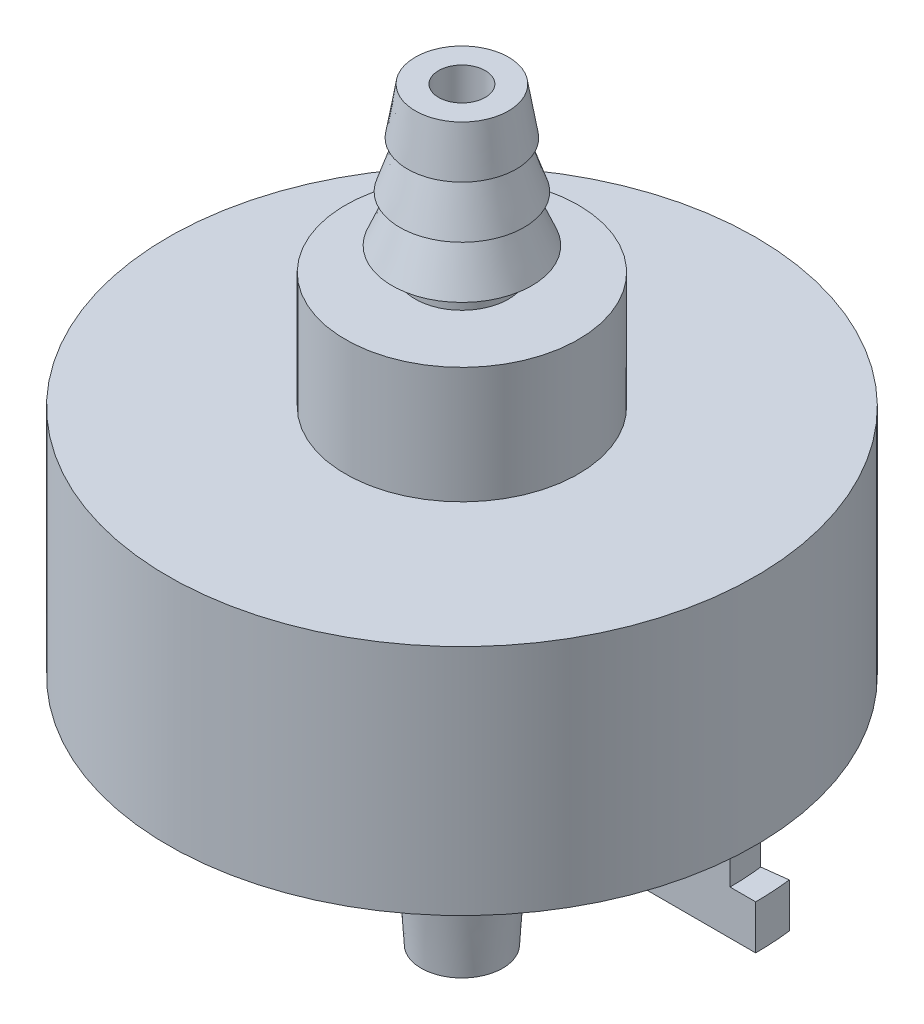
ISO-10303-21;
HEADER;
FILE_DESCRIPTION(('STEP AP214'),'2;1');
FILE_NAME('part.step','',(''),(''),'','','');
FILE_SCHEMA(('AUTOMOTIVE_DESIGN { 1 0 10303 214 1 1 1 1 }'));
ENDSEC;
DATA;
#1=APPLICATION_CONTEXT('core data for automotive mechanical design processes');
#2=APPLICATION_PROTOCOL_DEFINITION('international standard','automotive_design',2000,#1);
#3=PRODUCT_CONTEXT('',#1,'mechanical');
#4=PRODUCT('Part','Part','',(#3));
#5=PRODUCT_RELATED_PRODUCT_CATEGORY('part','',(#4));
#6=PRODUCT_DEFINITION_FORMATION('','',#4);
#7=PRODUCT_DEFINITION_CONTEXT('part definition',#1,'design');
#8=PRODUCT_DEFINITION('design','',#6,#7);
#9=PRODUCT_DEFINITION_SHAPE('','',#8);
#10=(LENGTH_UNIT() NAMED_UNIT(*) SI_UNIT(.MILLI.,.METRE.));
#11=(NAMED_UNIT(*) PLANE_ANGLE_UNIT() SI_UNIT($,.RADIAN.));
#12=(NAMED_UNIT(*) SI_UNIT($,.STERADIAN.) SOLID_ANGLE_UNIT());
#13=UNCERTAINTY_MEASURE_WITH_UNIT(LENGTH_MEASURE(1.E-05),#10,'distance_accuracy_value','');
#14=(GEOMETRIC_REPRESENTATION_CONTEXT(3) GLOBAL_UNCERTAINTY_ASSIGNED_CONTEXT((#13)) GLOBAL_UNIT_ASSIGNED_CONTEXT((#10,
#11,#12)) REPRESENTATION_CONTEXT('',''));
#15=CARTESIAN_POINT('',(0.,0.,0.));
#16=DIRECTION('',(0.,0.,1.));
#17=DIRECTION('',(1.,0.,0.));
#18=AXIS2_PLACEMENT_3D('',#15,#16,#17);
#19=CARTESIAN_POINT('',(8.97890000000001,-10.,0.));
#20=DIRECTION('',(0.,-1.,0.));
#21=DIRECTION('',(0.,0.,-1.));
#22=AXIS2_PLACEMENT_3D('',#19,#20,#21);
#23=PLANE('',#22);
#24=CARTESIAN_POINT('',(8.97890000000001,-10.,0.));
#25=DIRECTION('',(0.,-1.,0.));
#26=DIRECTION('',(0.,0.,-1.));
#27=AXIS2_PLACEMENT_3D('',#24,#25,#26);
#28=CIRCLE('',#27,12.61);
#29=CARTESIAN_POINT('',(8.97890000000001,-10.,-12.61));
#30=VERTEX_POINT('',#29);
#31=EDGE_CURVE('E288',#30,#30,#28,.T.);
#32=ORIENTED_EDGE('',*,*,#31,.T.);
#33=EDGE_LOOP('',(#32));
#34=FACE_BOUND('',#33,.T.);
#35=DIRECTION('',(-0.992546151641322,0.,0.121869343405148));
#36=VECTOR('',#35,1.);
#37=CARTESIAN_POINT('',(-2.4453062053916,-10.,1.40271614259325));
#38=LINE('',#37,#36);
#39=CARTESIAN_POINT('',(0.135313788875836,-10.,1.08585584973987));
#40=VERTEX_POINT('',#39);
#41=CARTESIAN_POINT('',(-2.4453062053916,-10.,1.40271614259325));
#42=VERTEX_POINT('',#41);
#43=EDGE_CURVE('E256',#40,#42,#38,.T.);
#44=ORIENTED_EDGE('',*,*,#43,.F.);
#45=CARTESIAN_POINT('',(8.97890000000001,-10.,0.));
#46=DIRECTION('',(0.,-1.,0.));
#47=DIRECTION('',(0.,0.,-1.));
#48=AXIS2_PLACEMENT_3D('',#45,#46,#47);
#49=CIRCLE('',#48,8.91);
#50=CARTESIAN_POINT('',(0.0689000000000152,-10.,0.));
#51=VERTEX_POINT('',#50);
#52=EDGE_CURVE('E280',#40,#51,#49,.T.);
#53=ORIENTED_EDGE('',*,*,#52,.T.);
#54=DIRECTION('',(-1.,0.,0.));
#55=VECTOR('',#54,1.);
#56=CARTESIAN_POINT('',(-2.53109999999998,-10.,0.));
#57=LINE('',#56,#55);
#58=CARTESIAN_POINT('',(-2.53109999999998,-10.,0.));
#59=VERTEX_POINT('',#58);
#60=EDGE_CURVE('E234',#51,#59,#57,.T.);
#61=ORIENTED_EDGE('',*,*,#60,.T.);
#62=CARTESIAN_POINT('',(8.97890000000001,-10.,0.));
#63=DIRECTION('',(0.,-1.,0.));
#64=DIRECTION('',(0.,0.,-1.));
#65=AXIS2_PLACEMENT_3D('',#62,#63,#64);
#66=CIRCLE('',#65,11.51);
#67=EDGE_CURVE('E278',#42,#59,#66,.T.);
#68=ORIENTED_EDGE('',*,*,#67,.F.);
#69=EDGE_LOOP('',(#44,#53,#61,#68));
#70=FACE_BOUND('',#69,.T.);
#71=DIRECTION('',(0.992546151641322,0.,-0.121869343405148));
#72=VECTOR('',#71,1.);
#73=CARTESIAN_POINT('',(20.4031062053916,-10.,-1.40271614259325));
#74=LINE('',#73,#72);
#75=CARTESIAN_POINT('',(17.8224862111242,-10.,-1.08585584973987));
#76=VERTEX_POINT('',#75);
#77=CARTESIAN_POINT('',(20.4031062053916,-10.,-1.40271614259325));
#78=VERTEX_POINT('',#77);
#79=EDGE_CURVE('E200',#76,#78,#74,.T.);
#80=ORIENTED_EDGE('',*,*,#79,.F.);
#81=CARTESIAN_POINT('',(8.97890000000001,-10.,0.));
#82=DIRECTION('',(0.,-1.,0.));
#83=DIRECTION('',(0.,0.,1.));
#84=AXIS2_PLACEMENT_3D('',#81,#82,#83);
#85=CIRCLE('',#84,8.91);
#86=CARTESIAN_POINT('',(17.8889,-10.,0.));
#87=VERTEX_POINT('',#86);
#88=EDGE_CURVE('E223',#76,#87,#85,.T.);
#89=ORIENTED_EDGE('',*,*,#88,.T.);
#90=DIRECTION('',(1.,0.,0.));
#91=VECTOR('',#90,1.);
#92=CARTESIAN_POINT('',(20.4889,-10.,0.));
#93=LINE('',#92,#91);
#94=CARTESIAN_POINT('',(20.4889,-10.,0.));
#95=VERTEX_POINT('',#94);
#96=EDGE_CURVE('E179',#87,#95,#93,.T.);
#97=ORIENTED_EDGE('',*,*,#96,.T.);
#98=CARTESIAN_POINT('',(8.97890000000001,-10.,0.));
#99=DIRECTION('',(0.,-1.,0.));
#100=DIRECTION('',(0.,0.,1.));
#101=AXIS2_PLACEMENT_3D('',#98,#99,#100);
#102=CIRCLE('',#101,11.51);
#103=EDGE_CURVE('E221',#78,#95,#102,.T.);
#104=ORIENTED_EDGE('',*,*,#103,.F.);
#105=EDGE_LOOP('',(#80,#89,#97,#104));
#106=FACE_BOUND('',#105,.T.);
#107=CARTESIAN_POINT('',(8.97890000000001,-10.,0.));
#108=DIRECTION('',(0.,-1.,0.));
#109=DIRECTION('',(0.,0.,-1.));
#110=AXIS2_PLACEMENT_3D('',#107,#108,#109);
#111=CIRCLE('',#110,2.75);
#112=CARTESIAN_POINT('',(6.90017726364211,-10.,-1.80039211988631));
#113=VERTEX_POINT('',#112);
#114=EDGE_CURVE('E335',#113,#113,#111,.T.);
#115=ORIENTED_EDGE('',*,*,#114,.F.);
#116=EDGE_LOOP('',(#115));
#117=FACE_BOUND('',#116,.T.);
#118=ADVANCED_FACE('F37',(#34,#70,#106,#117),#23,.T.);
#119=CARTESIAN_POINT('',(8.97890000000001,0.,0.));
#120=DIRECTION('',(0.,-1.,0.));
#121=DIRECTION('',(0.,0.,-1.));
#122=AXIS2_PLACEMENT_3D('',#119,#120,#121);
#123=CYLINDRICAL_SURFACE('',#122,0.999999999999999);
#124=CARTESIAN_POINT('',(8.97890000000001,12.,0.));
#125=DIRECTION('',(0.,-1.,0.));
#126=DIRECTION('',(0.,0.,-1.));
#127=AXIS2_PLACEMENT_3D('',#124,#125,#126);
#128=CIRCLE('',#127,0.999999999999999);
#129=CARTESIAN_POINT('',(8.97890000000001,12.,-0.999999999999999));
#130=VERTEX_POINT('',#129);
#131=EDGE_CURVE('E12',#130,#130,#128,.T.);
#132=ORIENTED_EDGE('',*,*,#131,.F.);
#133=EDGE_LOOP('',(#132));
#134=FACE_BOUND('',#133,.T.);
#135=CARTESIAN_POINT('',(8.97890000000001,-20.,0.));
#136=DIRECTION('',(0.,-1.,0.));
#137=DIRECTION('',(0.,0.,-1.));
#138=AXIS2_PLACEMENT_3D('',#135,#136,#137);
#139=CIRCLE('',#138,0.999999999999996);
#140=CARTESIAN_POINT('',(8.97890000000001,-20.,-0.999999999999996));
#141=VERTEX_POINT('',#140);
#142=EDGE_CURVE('E333',#141,#141,#139,.T.);
#143=ORIENTED_EDGE('',*,*,#142,.T.);
#144=EDGE_LOOP('',(#143));
#145=FACE_BOUND('',#144,.T.);
#146=ADVANCED_FACE('F39',(#134,#145),#123,.F.);
#147=CARTESIAN_POINT('',(7.97890000000001,12.,0.));
#148=DIRECTION('',(0.,-1.,0.));
#149=DIRECTION('',(0.,0.,-1.));
#150=AXIS2_PLACEMENT_3D('',#147,#148,#149);
#151=PLANE('',#150);
#152=CARTESIAN_POINT('',(8.97890000000001,12.,0.));
#153=DIRECTION('',(0.,-1.,0.));
#154=DIRECTION('',(0.,0.,-1.));
#155=AXIS2_PLACEMENT_3D('',#152,#153,#154);
#156=CIRCLE('',#155,2.);
#157=CARTESIAN_POINT('',(8.97890000000001,12.,-2.));
#158=VERTEX_POINT('',#157);
#159=EDGE_CURVE('E45',#158,#158,#156,.T.);
#160=ORIENTED_EDGE('',*,*,#159,.F.);
#161=EDGE_LOOP('',(#160));
#162=FACE_BOUND('',#161,.T.);
#163=ORIENTED_EDGE('',*,*,#131,.T.);
#164=EDGE_LOOP('',(#163));
#165=FACE_BOUND('',#164,.T.);
#166=ADVANCED_FACE('F324',(#162,#165),#151,.F.);
#167=CARTESIAN_POINT('',(8.97890000000001,12.,0.));
#168=DIRECTION('',(0.,-1.,0.));
#169=DIRECTION('',(0.,0.,-1.));
#170=AXIS2_PLACEMENT_3D('',#167,#168,#169);
#171=CONICAL_SURFACE('',#170,2.,0.165148677414627);
#172=CARTESIAN_POINT('',(8.97890000000001,10.,0.));
#173=DIRECTION('',(0.,-1.,0.));
#174=DIRECTION('',(0.,0.,-1.));
#175=AXIS2_PLACEMENT_3D('',#172,#173,#174);
#176=CIRCLE('',#175,2.33333333333333);
#177=CARTESIAN_POINT('',(8.97890000000001,10.,-2.33333333333333));
#178=VERTEX_POINT('',#177);
#179=EDGE_CURVE('E317',#178,#178,#176,.T.);
#180=ORIENTED_EDGE('',*,*,#179,.F.);
#181=EDGE_LOOP('',(#180));
#182=FACE_BOUND('',#181,.T.);
#183=ORIENTED_EDGE('',*,*,#159,.T.);
#184=EDGE_LOOP('',(#183));
#185=FACE_BOUND('',#184,.T.);
#186=ADVANCED_FACE('F322',(#182,#185),#171,.T.);
#187=CARTESIAN_POINT('',(6.97890000000001,10.,0.));
#188=DIRECTION('',(0.,1.,0.));
#189=DIRECTION('',(0.,0.,1.));
#190=AXIS2_PLACEMENT_3D('',#187,#188,#189);
#191=PLANE('',#190);
#192=CARTESIAN_POINT('',(8.97890000000001,10.,0.));
#193=DIRECTION('',(0.,-1.,0.));
#194=DIRECTION('',(0.,0.,-1.));
#195=AXIS2_PLACEMENT_3D('',#192,#193,#194);
#196=CIRCLE('',#195,2.);
#197=CARTESIAN_POINT('',(8.97890000000001,10.,-2.));
#198=VERTEX_POINT('',#197);
#199=EDGE_CURVE('E314',#198,#198,#196,.T.);
#200=ORIENTED_EDGE('',*,*,#199,.F.);
#201=EDGE_LOOP('',(#200));
#202=FACE_BOUND('',#201,.T.);
#203=ORIENTED_EDGE('',*,*,#179,.T.);
#204=EDGE_LOOP('',(#203));
#205=FACE_BOUND('',#204,.T.);
#206=ADVANCED_FACE('F483',(#202,#205),#191,.F.);
#207=CARTESIAN_POINT('',(8.97890000000001,10.,0.));
#208=DIRECTION('',(0.,-1.,0.));
#209=DIRECTION('',(0.,0.,-1.));
#210=AXIS2_PLACEMENT_3D('',#207,#208,#209);
#211=CONICAL_SURFACE('',#210,2.,0.321750554396643);
#212=CARTESIAN_POINT('',(8.97890000000001,8.,0.));
#213=DIRECTION('',(0.,-1.,0.));
#214=DIRECTION('',(0.,0.,-1.));
#215=AXIS2_PLACEMENT_3D('',#212,#213,#214);
#216=CIRCLE('',#215,2.66666666666667);
#217=CARTESIAN_POINT('',(8.97890000000001,8.,-2.66666666666667));
#218=VERTEX_POINT('',#217);
#219=EDGE_CURVE('E311',#218,#218,#216,.T.);
#220=ORIENTED_EDGE('',*,*,#219,.F.);
#221=EDGE_LOOP('',(#220));
#222=FACE_BOUND('',#221,.T.);
#223=ORIENTED_EDGE('',*,*,#199,.T.);
#224=EDGE_LOOP('',(#223));
#225=FACE_BOUND('',#224,.T.);
#226=ADVANCED_FACE('F479',(#222,#225),#211,.T.);
#227=CARTESIAN_POINT('',(6.31223333333335,8.,0.));
#228=DIRECTION('',(0.,1.,0.));
#229=DIRECTION('',(0.,0.,1.));
#230=AXIS2_PLACEMENT_3D('',#227,#228,#229);
#231=PLANE('',#230);
#232=CARTESIAN_POINT('',(8.97890000000001,8.,0.));
#233=DIRECTION('',(0.,-1.,0.));
#234=DIRECTION('',(0.,0.,-1.));
#235=AXIS2_PLACEMENT_3D('',#232,#233,#234);
#236=CIRCLE('',#235,2.16666666666667);
#237=CARTESIAN_POINT('',(8.97890000000001,8.,-2.16666666666667));
#238=VERTEX_POINT('',#237);
#239=EDGE_CURVE('E308',#238,#238,#236,.T.);
#240=ORIENTED_EDGE('',*,*,#239,.F.);
#241=EDGE_LOOP('',(#240));
#242=FACE_BOUND('',#241,.T.);
#243=ORIENTED_EDGE('',*,*,#219,.T.);
#244=EDGE_LOOP('',(#243));
#245=FACE_BOUND('',#244,.T.);
#246=ADVANCED_FACE('F475',(#242,#245),#231,.F.);
#247=CARTESIAN_POINT('',(8.97890000000001,8.,0.));
#248=DIRECTION('',(0.,-1.,0.));
#249=DIRECTION('',(0.,0.,-1.));
#250=AXIS2_PLACEMENT_3D('',#247,#248,#249);
#251=CONICAL_SURFACE('',#250,2.16666666666667,0.394791119699761);
#252=CARTESIAN_POINT('',(8.97890000000001,6.,0.));
#253=DIRECTION('',(0.,-1.,0.));
#254=DIRECTION('',(0.,0.,-1.));
#255=AXIS2_PLACEMENT_3D('',#252,#253,#254);
#256=CIRCLE('',#255,3.);
#257=CARTESIAN_POINT('',(8.97890000000001,6.,-3.));
#258=VERTEX_POINT('',#257);
#259=EDGE_CURVE('E305',#258,#258,#256,.T.);
#260=ORIENTED_EDGE('',*,*,#259,.F.);
#261=EDGE_LOOP('',(#260));
#262=FACE_BOUND('',#261,.T.);
#263=ORIENTED_EDGE('',*,*,#239,.T.);
#264=EDGE_LOOP('',(#263));
#265=FACE_BOUND('',#264,.T.);
#266=ADVANCED_FACE('F471',(#262,#265),#251,.T.);
#267=CARTESIAN_POINT('',(6.97890000000001,6.,0.));
#268=DIRECTION('',(0.,1.,0.));
#269=DIRECTION('',(0.,0.,1.));
#270=AXIS2_PLACEMENT_3D('',#267,#268,#269);
#271=PLANE('',#270);
#272=CARTESIAN_POINT('',(8.97890000000001,6.,0.));
#273=DIRECTION('',(0.,-1.,0.));
#274=DIRECTION('',(0.,0.,-1.));
#275=AXIS2_PLACEMENT_3D('',#272,#273,#274);
#276=CIRCLE('',#275,2.);
#277=CARTESIAN_POINT('',(8.97890000000001,6.,-2.));
#278=VERTEX_POINT('',#277);
#279=EDGE_CURVE('E302',#278,#278,#276,.T.);
#280=ORIENTED_EDGE('',*,*,#279,.F.);
#281=EDGE_LOOP('',(#280));
#282=FACE_BOUND('',#281,.T.);
#283=ORIENTED_EDGE('',*,*,#259,.T.);
#284=EDGE_LOOP('',(#283));
#285=FACE_BOUND('',#284,.T.);
#286=ADVANCED_FACE('F467',(#282,#285),#271,.F.);
#287=CARTESIAN_POINT('',(8.97890000000001,0.,0.));
#288=DIRECTION('',(0.,-1.,0.));
#289=DIRECTION('',(0.,0.,-1.));
#290=AXIS2_PLACEMENT_3D('',#287,#288,#289);
#291=CYLINDRICAL_SURFACE('',#290,2.);
#292=CARTESIAN_POINT('',(8.97890000000001,5.,0.));
#293=DIRECTION('',(0.,-1.,0.));
#294=DIRECTION('',(0.,0.,-1.));
#295=AXIS2_PLACEMENT_3D('',#292,#293,#294);
#296=CIRCLE('',#295,2.);
#297=CARTESIAN_POINT('',(8.97890000000001,5.,-2.));
#298=VERTEX_POINT('',#297);
#299=EDGE_CURVE('E299',#298,#298,#296,.T.);
#300=ORIENTED_EDGE('',*,*,#299,.F.);
#301=EDGE_LOOP('',(#300));
#302=FACE_BOUND('',#301,.T.);
#303=ORIENTED_EDGE('',*,*,#279,.T.);
#304=EDGE_LOOP('',(#303));
#305=FACE_BOUND('',#304,.T.);
#306=ADVANCED_FACE('F463',(#302,#305),#291,.T.);
#307=CARTESIAN_POINT('',(6.97890000000001,5.,0.));
#308=DIRECTION('',(0.,-1.,0.));
#309=DIRECTION('',(0.,0.,-1.));
#310=AXIS2_PLACEMENT_3D('',#307,#308,#309);
#311=PLANE('',#310);
#312=CARTESIAN_POINT('',(8.97890000000001,5.,0.));
#313=DIRECTION('',(0.,-1.,0.));
#314=DIRECTION('',(0.,0.,-1.));
#315=AXIS2_PLACEMENT_3D('',#312,#313,#314);
#316=CIRCLE('',#315,5.);
#317=CARTESIAN_POINT('',(8.97890000000001,5.,-5.));
#318=VERTEX_POINT('',#317);
#319=EDGE_CURVE('E296',#318,#318,#316,.T.);
#320=ORIENTED_EDGE('',*,*,#319,.F.);
#321=EDGE_LOOP('',(#320));
#322=FACE_BOUND('',#321,.T.);
#323=ORIENTED_EDGE('',*,*,#299,.T.);
#324=EDGE_LOOP('',(#323));
#325=FACE_BOUND('',#324,.T.);
#326=ADVANCED_FACE('F459',(#322,#325),#311,.F.);
#327=CARTESIAN_POINT('',(8.97890000000001,0.,0.));
#328=DIRECTION('',(0.,-1.,0.));
#329=DIRECTION('',(0.,0.,-1.));
#330=AXIS2_PLACEMENT_3D('',#327,#328,#329);
#331=CYLINDRICAL_SURFACE('',#330,5.);
#332=CARTESIAN_POINT('',(8.97890000000001,0.,0.));
#333=DIRECTION('',(0.,-1.,0.));
#334=DIRECTION('',(0.,0.,-1.));
#335=AXIS2_PLACEMENT_3D('',#332,#333,#334);
#336=CIRCLE('',#335,5.);
#337=CARTESIAN_POINT('',(8.97890000000001,0.,-5.));
#338=VERTEX_POINT('',#337);
#339=EDGE_CURVE('E291',#338,#338,#336,.T.);
#340=ORIENTED_EDGE('',*,*,#339,.F.);
#341=EDGE_LOOP('',(#340));
#342=FACE_BOUND('',#341,.T.);
#343=ORIENTED_EDGE('',*,*,#319,.T.);
#344=EDGE_LOOP('',(#343));
#345=FACE_BOUND('',#344,.T.);
#346=ADVANCED_FACE('F452',(#342,#345),#331,.T.);
#347=CARTESIAN_POINT('',(8.97890000000001,0.,0.));
#348=DIRECTION('',(0.,-1.,0.));
#349=DIRECTION('',(0.,0.,-1.));
#350=AXIS2_PLACEMENT_3D('',#347,#348,#349);
#351=PLANE('',#350);
#352=ORIENTED_EDGE('',*,*,#339,.T.);
#353=EDGE_LOOP('',(#352));
#354=FACE_BOUND('',#353,.T.);
#355=CARTESIAN_POINT('',(8.97890000000001,0.,0.));
#356=DIRECTION('',(0.,-1.,0.));
#357=DIRECTION('',(0.,0.,-1.));
#358=AXIS2_PLACEMENT_3D('',#355,#356,#357);
#359=CIRCLE('',#358,12.61);
#360=CARTESIAN_POINT('',(8.97890000000001,0.,-12.61));
#361=VERTEX_POINT('',#360);
#362=EDGE_CURVE('E287',#361,#361,#359,.T.);
#363=ORIENTED_EDGE('',*,*,#362,.F.);
#364=EDGE_LOOP('',(#363));
#365=FACE_BOUND('',#364,.T.);
#366=ADVANCED_FACE('F449',(#354,#365),#351,.F.);
#367=CARTESIAN_POINT('',(8.97890000000001,-10.,0.));
#368=DIRECTION('',(0.,1.,0.));
#369=DIRECTION('',(0.,0.,1.));
#370=AXIS2_PLACEMENT_3D('',#367,#368,#369);
#371=CYLINDRICAL_SURFACE('',#370,12.61);
#372=ORIENTED_EDGE('',*,*,#31,.F.);
#373=EDGE_LOOP('',(#372));
#374=FACE_BOUND('',#373,.T.);
#375=ORIENTED_EDGE('',*,*,#362,.T.);
#376=EDGE_LOOP('',(#375));
#377=FACE_BOUND('',#376,.T.);
#378=ADVANCED_FACE('F422',(#374,#377),#371,.T.);
#379=CARTESIAN_POINT('',(8.97890000000001,-10.,0.));
#380=DIRECTION('',(0.,-1.,0.));
#381=DIRECTION('',(0.,0.,-1.));
#382=AXIS2_PLACEMENT_3D('',#379,#380,#381);
#383=CYLINDRICAL_SURFACE('',#382,7.81);
#384=CARTESIAN_POINT('',(8.97890000000001,-12.1,0.));
#385=DIRECTION('',(0.,-1.,0.));
#386=DIRECTION('',(0.,0.,-1.));
#387=AXIS2_PLACEMENT_3D('',#384,#385,#386);
#388=CIRCLE('',#387,7.81);
#389=CARTESIAN_POINT('',(1.22711455568129,-12.1,0.951799571994204));
#390=VERTEX_POINT('',#389);
#391=CARTESIAN_POINT('',(1.16890000000002,-12.1,0.));
#392=VERTEX_POINT('',#391);
#393=EDGE_CURVE('E285',#390,#392,#388,.T.);
#394=ORIENTED_EDGE('',*,*,#393,.F.);
#395=DIRECTION('',(0.,1.,0.));
#396=VECTOR('',#395,1.);
#397=CARTESIAN_POINT('',(1.22711455568129,-12.1,0.951799571994204));
#398=LINE('',#397,#396);
#399=CARTESIAN_POINT('',(1.22711455568129,-14.,0.951799571994204));
#400=VERTEX_POINT('',#399);
#401=EDGE_CURVE('E247',#400,#390,#398,.T.);
#402=ORIENTED_EDGE('',*,*,#401,.F.);
#403=CARTESIAN_POINT('',(8.97890000000001,-14.,0.));
#404=DIRECTION('',(0.,-1.,0.));
#405=DIRECTION('',(0.,0.,-1.));
#406=AXIS2_PLACEMENT_3D('',#403,#404,#405);
#407=CIRCLE('',#406,7.81);
#408=CARTESIAN_POINT('',(1.16890000000002,-14.,0.));
#409=VERTEX_POINT('',#408);
#410=EDGE_CURVE('E270',#400,#409,#407,.T.);
#411=ORIENTED_EDGE('',*,*,#410,.T.);
#412=DIRECTION('',(0.,1.,0.));
#413=VECTOR('',#412,1.);
#414=CARTESIAN_POINT('',(1.16890000000002,-12.1,0.));
#415=LINE('',#414,#413);
#416=EDGE_CURVE('E165',#409,#392,#415,.T.);
#417=ORIENTED_EDGE('',*,*,#416,.T.);
#418=EDGE_LOOP('',(#394,#402,#411,#417));
#419=FACE_BOUND('',#418,.T.);
#420=ADVANCED_FACE('F418',(#419),#383,.F.);
#421=CARTESIAN_POINT('',(1.22711455568129,-12.1,0.951799571994204));
#422=DIRECTION('',(0.,-1.,0.));
#423=DIRECTION('',(0.,0.,-1.));
#424=AXIS2_PLACEMENT_3D('',#421,#422,#423);
#425=PLANE('',#424);
#426=CARTESIAN_POINT('',(8.97890000000001,-12.1,0.));
#427=DIRECTION('',(0.,-1.,0.));
#428=DIRECTION('',(0.,0.,-1.));
#429=AXIS2_PLACEMENT_3D('',#426,#427,#428);
#430=CIRCLE('',#429,8.91);
#431=CARTESIAN_POINT('',(0.135313788875837,-12.1,1.08585584973987));
#432=VERTEX_POINT('',#431);
#433=CARTESIAN_POINT('',(0.0689000000000156,-12.1,0.));
#434=VERTEX_POINT('',#433);
#435=EDGE_CURVE('E283',#432,#434,#430,.T.);
#436=ORIENTED_EDGE('',*,*,#435,.F.);
#437=DIRECTION('',(-0.992546151641322,0.,0.121869343405148));
#438=VECTOR('',#437,1.);
#439=CARTESIAN_POINT('',(1.22711455568129,-12.1,0.951799571994204));
#440=LINE('',#439,#438);
#441=EDGE_CURVE('E250',#390,#432,#440,.T.);
#442=ORIENTED_EDGE('',*,*,#441,.F.);
#443=ORIENTED_EDGE('',*,*,#393,.T.);
#444=DIRECTION('',(-1.,0.,0.));
#445=VECTOR('',#444,1.);
#446=CARTESIAN_POINT('',(1.16890000000002,-12.1,0.));
#447=LINE('',#446,#445);
#448=EDGE_CURVE('E229',#392,#434,#447,.T.);
#449=ORIENTED_EDGE('',*,*,#448,.T.);
#450=EDGE_LOOP('',(#436,#442,#443,#449));
#451=FACE_BOUND('',#450,.T.);
#452=ADVANCED_FACE('F421',(#451),#425,.F.);
#453=CARTESIAN_POINT('',(8.97890000000001,-10.,0.));
#454=DIRECTION('',(0.,-1.,0.));
#455=DIRECTION('',(0.,0.,-1.));
#456=AXIS2_PLACEMENT_3D('',#453,#454,#455);
#457=CYLINDRICAL_SURFACE('',#456,8.91);
#458=ORIENTED_EDGE('',*,*,#52,.F.);
#459=DIRECTION('',(0.,1.,0.));
#460=VECTOR('',#459,1.);
#461=CARTESIAN_POINT('',(0.135313788875836,-10.,1.08585584973987));
#462=LINE('',#461,#460);
#463=EDGE_CURVE('E253',#432,#40,#462,.T.);
#464=ORIENTED_EDGE('',*,*,#463,.F.);
#465=ORIENTED_EDGE('',*,*,#435,.T.);
#466=DIRECTION('',(0.,1.,0.));
#467=VECTOR('',#466,1.);
#468=CARTESIAN_POINT('',(0.0689000000000152,-10.,0.));
#469=LINE('',#468,#467);
#470=EDGE_CURVE('E232',#434,#51,#469,.T.);
#471=ORIENTED_EDGE('',*,*,#470,.T.);
#472=EDGE_LOOP('',(#458,#464,#465,#471));
#473=FACE_BOUND('',#472,.T.);
#474=ADVANCED_FACE('F438',(#473),#457,.F.);
#475=CARTESIAN_POINT('',(8.97890000000001,-10.,0.));
#476=DIRECTION('',(0.,-1.,0.));
#477=DIRECTION('',(0.,0.,-1.));
#478=AXIS2_PLACEMENT_3D('',#475,#476,#477);
#479=CYLINDRICAL_SURFACE('',#478,11.51);
#480=CARTESIAN_POINT('',(8.97890000000001,-12.1,0.));
#481=DIRECTION('',(0.,-1.,0.));
#482=DIRECTION('',(0.,0.,-1.));
#483=AXIS2_PLACEMENT_3D('',#480,#481,#482);
#484=CIRCLE('',#483,11.51);
#485=CARTESIAN_POINT('',(-2.4453062053916,-12.1,1.40271614259325));
#486=VERTEX_POINT('',#485);
#487=CARTESIAN_POINT('',(-2.53109999999998,-12.1,0.));
#488=VERTEX_POINT('',#487);
#489=EDGE_CURVE('E276',#486,#488,#484,.T.);
#490=ORIENTED_EDGE('',*,*,#489,.F.);
#491=DIRECTION('',(0.,-1.,0.));
#492=VECTOR('',#491,1.);
#493=CARTESIAN_POINT('',(-2.4453062053916,-10.,1.40271614259325));
#494=LINE('',#493,#492);
#495=EDGE_CURVE('E258',#42,#486,#494,.T.);
#496=ORIENTED_EDGE('',*,*,#495,.F.);
#497=ORIENTED_EDGE('',*,*,#67,.T.);
#498=DIRECTION('',(0.,-1.,0.));
#499=VECTOR('',#498,1.);
#500=CARTESIAN_POINT('',(-2.53109999999998,-10.,0.));
#501=LINE('',#500,#499);
#502=EDGE_CURVE('E60',#59,#488,#501,.T.);
#503=ORIENTED_EDGE('',*,*,#502,.T.);
#504=EDGE_LOOP('',(#490,#496,#497,#503));
#505=FACE_BOUND('',#504,.T.);
#506=ADVANCED_FACE('F434',(#505),#479,.T.);
#507=CARTESIAN_POINT('',(-3.53710697219705,-12.1,1.53677242033891));
#508=DIRECTION('',(0.,-1.,0.));
#509=DIRECTION('',(0.,0.,-1.));
#510=AXIS2_PLACEMENT_3D('',#507,#508,#509);
#511=PLANE('',#510);
#512=CARTESIAN_POINT('',(8.97890000000001,-12.1,0.));
#513=DIRECTION('',(0.,-1.,0.));
#514=DIRECTION('',(0.,0.,-1.));
#515=AXIS2_PLACEMENT_3D('',#512,#513,#514);
#516=CIRCLE('',#515,12.61);
#517=CARTESIAN_POINT('',(-3.53710697219705,-12.1,1.53677242033891));
#518=VERTEX_POINT('',#517);
#519=CARTESIAN_POINT('',(-3.63109999999998,-12.1,0.));
#520=VERTEX_POINT('',#519);
#521=EDGE_CURVE('E274',#518,#520,#516,.T.);
#522=ORIENTED_EDGE('',*,*,#521,.F.);
#523=DIRECTION('',(-0.992546151641322,0.,0.121869343405148));
#524=VECTOR('',#523,1.);
#525=CARTESIAN_POINT('',(-3.53710697219705,-12.1,1.53677242033891));
#526=LINE('',#525,#524);
#527=EDGE_CURVE('E261',#486,#518,#526,.T.);
#528=ORIENTED_EDGE('',*,*,#527,.F.);
#529=ORIENTED_EDGE('',*,*,#489,.T.);
#530=DIRECTION('',(-1.,0.,0.));
#531=VECTOR('',#530,1.);
#532=CARTESIAN_POINT('',(-3.63109999999998,-12.1,0.));
#533=LINE('',#532,#531);
#534=EDGE_CURVE('E238',#488,#520,#533,.T.);
#535=ORIENTED_EDGE('',*,*,#534,.T.);
#536=EDGE_LOOP('',(#522,#528,#529,#535));
#537=FACE_BOUND('',#536,.T.);
#538=ADVANCED_FACE('F430',(#537),#511,.F.);
#539=CARTESIAN_POINT('',(8.97890000000001,-10.,0.));
#540=DIRECTION('',(0.,-1.,0.));
#541=DIRECTION('',(0.,0.,-1.));
#542=AXIS2_PLACEMENT_3D('',#539,#540,#541);
#543=CYLINDRICAL_SURFACE('',#542,12.61);
#544=CARTESIAN_POINT('',(8.97890000000001,-14.,0.));
#545=DIRECTION('',(0.,-1.,0.));
#546=DIRECTION('',(0.,0.,-1.));
#547=AXIS2_PLACEMENT_3D('',#544,#545,#546);
#548=CIRCLE('',#547,12.61);
#549=CARTESIAN_POINT('',(-3.53710697219705,-14.,1.53677242033891));
#550=VERTEX_POINT('',#549);
#551=CARTESIAN_POINT('',(-3.63109999999998,-14.,0.));
#552=VERTEX_POINT('',#551);
#553=EDGE_CURVE('E272',#550,#552,#548,.T.);
#554=ORIENTED_EDGE('',*,*,#553,.F.);
#555=DIRECTION('',(0.,-1.,0.));
#556=VECTOR('',#555,1.);
#557=CARTESIAN_POINT('',(-3.53710697219705,-12.1,1.53677242033891));
#558=LINE('',#557,#556);
#559=EDGE_CURVE('E264',#518,#550,#558,.T.);
#560=ORIENTED_EDGE('',*,*,#559,.F.);
#561=ORIENTED_EDGE('',*,*,#521,.T.);
#562=DIRECTION('',(0.,-1.,0.));
#563=VECTOR('',#562,1.);
#564=CARTESIAN_POINT('',(-3.63109999999998,-12.1,0.));
#565=LINE('',#564,#563);
#566=EDGE_CURVE('E241',#520,#552,#565,.T.);
#567=ORIENTED_EDGE('',*,*,#566,.T.);
#568=EDGE_LOOP('',(#554,#560,#561,#567));
#569=FACE_BOUND('',#568,.T.);
#570=ADVANCED_FACE('F426',(#569),#543,.T.);
#571=CARTESIAN_POINT('',(-3.53710697219705,-14.,1.53677242033891));
#572=DIRECTION('',(0.,1.,0.));
#573=DIRECTION('',(0.,0.,1.));
#574=AXIS2_PLACEMENT_3D('',#571,#572,#573);
#575=PLANE('',#574);
#576=DIRECTION('',(0.992546151641322,0.,-0.121869343405148));
#577=VECTOR('',#576,1.);
#578=CARTESIAN_POINT('',(-3.53710697219705,-14.,1.53677242033891));
#579=LINE('',#578,#577);
#580=EDGE_CURVE('E267',#550,#400,#579,.T.);
#581=ORIENTED_EDGE('',*,*,#580,.F.);
#582=ORIENTED_EDGE('',*,*,#553,.T.);
#583=DIRECTION('',(1.,0.,0.));
#584=VECTOR('',#583,1.);
#585=CARTESIAN_POINT('',(-3.63109999999998,-14.,0.));
#586=LINE('',#585,#584);
#587=EDGE_CURVE('E244',#552,#409,#586,.T.);
#588=ORIENTED_EDGE('',*,*,#587,.T.);
#589=ORIENTED_EDGE('',*,*,#410,.F.);
#590=EDGE_LOOP('',(#581,#582,#588,#589));
#591=FACE_BOUND('',#590,.T.);
#592=ADVANCED_FACE('F416',(#591),#575,.F.);
#593=CARTESIAN_POINT('',(0.0669273590277341,0.,1.09425264750048));
#594=DIRECTION('',(0.121869343405148,0.,0.992546151641322));
#595=DIRECTION('',(0.992546151641322,0.,-0.121869343405148));
#596=AXIS2_PLACEMENT_3D('',#593,#594,#595);
#597=PLANE('',#596);
#598=ORIENTED_EDGE('',*,*,#401,.T.);
#599=ORIENTED_EDGE('',*,*,#441,.T.);
#600=ORIENTED_EDGE('',*,*,#463,.T.);
#601=ORIENTED_EDGE('',*,*,#43,.T.);
#602=ORIENTED_EDGE('',*,*,#495,.T.);
#603=ORIENTED_EDGE('',*,*,#527,.T.);
#604=ORIENTED_EDGE('',*,*,#559,.T.);
#605=ORIENTED_EDGE('',*,*,#580,.T.);
#606=EDGE_LOOP('',(#598,#599,#600,#601,#602,#603,#604,#605));
#607=FACE_BOUND('',#606,.T.);
#608=ADVANCED_FACE('F413',(#607),#597,.T.);
#609=CARTESIAN_POINT('',(0.,0.,0.));
#610=DIRECTION('',(0.,0.,1.));
#611=DIRECTION('',(1.,0.,0.));
#612=AXIS2_PLACEMENT_3D('',#609,#610,#611);
#613=PLANE('',#612);
#614=ORIENTED_EDGE('',*,*,#416,.F.);
#615=ORIENTED_EDGE('',*,*,#587,.F.);
#616=ORIENTED_EDGE('',*,*,#566,.F.);
#617=ORIENTED_EDGE('',*,*,#534,.F.);
#618=ORIENTED_EDGE('',*,*,#502,.F.);
#619=ORIENTED_EDGE('',*,*,#60,.F.);
#620=ORIENTED_EDGE('',*,*,#470,.F.);
#621=ORIENTED_EDGE('',*,*,#448,.F.);
#622=EDGE_LOOP('',(#614,#615,#616,#617,#618,#619,#620,#621));
#623=FACE_BOUND('',#622,.T.);
#624=ADVANCED_FACE('F389',(#623),#613,.F.);
#625=CARTESIAN_POINT('',(8.97890000000001,-10.,0.));
#626=DIRECTION('',(0.,-1.,0.));
#627=DIRECTION('',(0.,0.,1.));
#628=AXIS2_PLACEMENT_3D('',#625,#626,#627);
#629=CYLINDRICAL_SURFACE('',#628,7.81);
#630=CARTESIAN_POINT('',(8.97890000000001,-12.1,0.));
#631=DIRECTION('',(0.,-1.,0.));
#632=DIRECTION('',(0.,0.,1.));
#633=AXIS2_PLACEMENT_3D('',#630,#631,#632);
#634=CIRCLE('',#633,7.81);
#635=CARTESIAN_POINT('',(16.7306854443187,-12.1,-0.951799571994204));
#636=VERTEX_POINT('',#635);
#637=CARTESIAN_POINT('',(16.7889,-12.1,0.));
#638=VERTEX_POINT('',#637);
#639=EDGE_CURVE('E154',#636,#638,#634,.T.);
#640=ORIENTED_EDGE('',*,*,#639,.F.);
#641=DIRECTION('',(0.,1.,0.));
#642=VECTOR('',#641,1.);
#643=CARTESIAN_POINT('',(16.7306854443187,-12.1,-0.951799571994204));
#644=LINE('',#643,#642);
#645=CARTESIAN_POINT('',(16.7306854443187,-14.,-0.951799571994204));
#646=VERTEX_POINT('',#645);
#647=EDGE_CURVE('E194',#646,#636,#644,.T.);
#648=ORIENTED_EDGE('',*,*,#647,.F.);
#649=CARTESIAN_POINT('',(8.97890000000001,-14.,0.));
#650=DIRECTION('',(0.,-1.,0.));
#651=DIRECTION('',(0.,0.,1.));
#652=AXIS2_PLACEMENT_3D('',#649,#650,#651);
#653=CIRCLE('',#652,7.81);
#654=CARTESIAN_POINT('',(16.7889,-14.,0.));
#655=VERTEX_POINT('',#654);
#656=EDGE_CURVE('E171',#646,#655,#653,.T.);
#657=ORIENTED_EDGE('',*,*,#656,.T.);
#658=DIRECTION('',(0.,1.,0.));
#659=VECTOR('',#658,1.);
#660=CARTESIAN_POINT('',(16.7889,-12.1,0.));
#661=LINE('',#660,#659);
#662=EDGE_CURVE('E169',#655,#638,#661,.T.);
#663=ORIENTED_EDGE('',*,*,#662,.T.);
#664=EDGE_LOOP('',(#640,#648,#657,#663));
#665=FACE_BOUND('',#664,.T.);
#666=ADVANCED_FACE('F170',(#665),#629,.F.);
#667=CARTESIAN_POINT('',(16.7306854443187,-12.1,-0.951799571994204));
#668=DIRECTION('',(0.,-1.,0.));
#669=DIRECTION('',(0.,0.,1.));
#670=AXIS2_PLACEMENT_3D('',#667,#668,#669);
#671=PLANE('',#670);
#672=CARTESIAN_POINT('',(8.97890000000001,-12.1,0.));
#673=DIRECTION('',(0.,-1.,0.));
#674=DIRECTION('',(0.,0.,1.));
#675=AXIS2_PLACEMENT_3D('',#672,#673,#674);
#676=CIRCLE('',#675,8.91);
#677=CARTESIAN_POINT('',(17.8224862111242,-12.1,-1.08585584973987));
#678=VERTEX_POINT('',#677);
#679=CARTESIAN_POINT('',(17.8889,-12.1,0.));
#680=VERTEX_POINT('',#679);
#681=EDGE_CURVE('E166',#678,#680,#676,.T.);
#682=ORIENTED_EDGE('',*,*,#681,.F.);
#683=DIRECTION('',(0.992546151641322,0.,-0.121869343405148));
#684=VECTOR('',#683,1.);
#685=CARTESIAN_POINT('',(16.7306854443187,-12.1,-0.951799571994204));
#686=LINE('',#685,#684);
#687=EDGE_CURVE('E161',#636,#678,#686,.T.);
#688=ORIENTED_EDGE('',*,*,#687,.F.);
#689=ORIENTED_EDGE('',*,*,#639,.T.);
#690=DIRECTION('',(1.,0.,0.));
#691=VECTOR('',#690,1.);
#692=CARTESIAN_POINT('',(16.7889,-12.1,0.));
#693=LINE('',#692,#691);
#694=EDGE_CURVE('E158',#638,#680,#693,.T.);
#695=ORIENTED_EDGE('',*,*,#694,.T.);
#696=EDGE_LOOP('',(#682,#688,#689,#695));
#697=FACE_BOUND('',#696,.T.);
#698=ADVANCED_FACE('F156',(#697),#671,.F.);
#699=CARTESIAN_POINT('',(8.97890000000001,-10.,0.));
#700=DIRECTION('',(0.,-1.,0.));
#701=DIRECTION('',(0.,0.,1.));
#702=AXIS2_PLACEMENT_3D('',#699,#700,#701);
#703=CYLINDRICAL_SURFACE('',#702,8.91);
#704=ORIENTED_EDGE('',*,*,#88,.F.);
#705=DIRECTION('',(0.,1.,0.));
#706=VECTOR('',#705,1.);
#707=CARTESIAN_POINT('',(17.8224862111242,-10.,-1.08585584973987));
#708=LINE('',#707,#706);
#709=EDGE_CURVE('E197',#678,#76,#708,.T.);
#710=ORIENTED_EDGE('',*,*,#709,.F.);
#711=ORIENTED_EDGE('',*,*,#681,.T.);
#712=DIRECTION('',(0.,1.,0.));
#713=VECTOR('',#712,1.);
#714=CARTESIAN_POINT('',(17.8889,-10.,0.));
#715=LINE('',#714,#713);
#716=EDGE_CURVE('E177',#680,#87,#715,.T.);
#717=ORIENTED_EDGE('',*,*,#716,.T.);
#718=EDGE_LOOP('',(#704,#710,#711,#717));
#719=FACE_BOUND('',#718,.T.);
#720=ADVANCED_FACE('F404',(#719),#703,.F.);
#721=CARTESIAN_POINT('',(8.97890000000001,-10.,0.));
#722=DIRECTION('',(0.,-1.,0.));
#723=DIRECTION('',(0.,0.,1.));
#724=AXIS2_PLACEMENT_3D('',#721,#722,#723);
#725=CYLINDRICAL_SURFACE('',#724,11.51);
#726=CARTESIAN_POINT('',(8.97890000000001,-12.1,0.));
#727=DIRECTION('',(0.,-1.,0.));
#728=DIRECTION('',(0.,0.,1.));
#729=AXIS2_PLACEMENT_3D('',#726,#727,#728);
#730=CIRCLE('',#729,11.51);
#731=CARTESIAN_POINT('',(20.4031062053916,-12.1,-1.40271614259325));
#732=VERTEX_POINT('',#731);
#733=CARTESIAN_POINT('',(20.4889,-12.1,0.));
#734=VERTEX_POINT('',#733);
#735=EDGE_CURVE('E219',#732,#734,#730,.T.);
#736=ORIENTED_EDGE('',*,*,#735,.F.);
#737=DIRECTION('',(0.,-1.,0.));
#738=VECTOR('',#737,1.);
#739=CARTESIAN_POINT('',(20.4031062053916,-10.,-1.40271614259325));
#740=LINE('',#739,#738);
#741=EDGE_CURVE('E202',#78,#732,#740,.T.);
#742=ORIENTED_EDGE('',*,*,#741,.F.);
#743=ORIENTED_EDGE('',*,*,#103,.T.);
#744=DIRECTION('',(0.,-1.,0.));
#745=VECTOR('',#744,1.);
#746=CARTESIAN_POINT('',(20.4889,-10.,0.));
#747=LINE('',#746,#745);
#748=EDGE_CURVE('E52',#95,#734,#747,.T.);
#749=ORIENTED_EDGE('',*,*,#748,.T.);
#750=EDGE_LOOP('',(#736,#742,#743,#749));
#751=FACE_BOUND('',#750,.T.);
#752=ADVANCED_FACE('F400',(#751),#725,.T.);
#753=CARTESIAN_POINT('',(21.4949069721971,-12.1,-1.53677242033891));
#754=DIRECTION('',(0.,-1.,0.));
#755=DIRECTION('',(0.,0.,1.));
#756=AXIS2_PLACEMENT_3D('',#753,#754,#755);
#757=PLANE('',#756);
#758=CARTESIAN_POINT('',(8.97890000000001,-12.1,0.));
#759=DIRECTION('',(0.,-1.,0.));
#760=DIRECTION('',(0.,0.,1.));
#761=AXIS2_PLACEMENT_3D('',#758,#759,#760);
#762=CIRCLE('',#761,12.61);
#763=CARTESIAN_POINT('',(21.4949069721971,-12.1,-1.53677242033891));
#764=VERTEX_POINT('',#763);
#765=CARTESIAN_POINT('',(21.5889,-12.1,0.));
#766=VERTEX_POINT('',#765);
#767=EDGE_CURVE('E217',#764,#766,#762,.T.);
#768=ORIENTED_EDGE('',*,*,#767,.F.);
#769=DIRECTION('',(0.992546151641322,0.,-0.121869343405148));
#770=VECTOR('',#769,1.);
#771=CARTESIAN_POINT('',(21.4949069721971,-12.1,-1.53677242033891));
#772=LINE('',#771,#770);
#773=EDGE_CURVE('E205',#732,#764,#772,.T.);
#774=ORIENTED_EDGE('',*,*,#773,.F.);
#775=ORIENTED_EDGE('',*,*,#735,.T.);
#776=DIRECTION('',(1.,0.,0.));
#777=VECTOR('',#776,1.);
#778=CARTESIAN_POINT('',(21.5889,-12.1,0.));
#779=LINE('',#778,#777);
#780=EDGE_CURVE('E186',#734,#766,#779,.T.);
#781=ORIENTED_EDGE('',*,*,#780,.T.);
#782=EDGE_LOOP('',(#768,#774,#775,#781));
#783=FACE_BOUND('',#782,.T.);
#784=ADVANCED_FACE('F396',(#783),#757,.F.);
#785=CARTESIAN_POINT('',(8.97890000000001,-10.,0.));
#786=DIRECTION('',(0.,-1.,0.));
#787=DIRECTION('',(0.,0.,1.));
#788=AXIS2_PLACEMENT_3D('',#785,#786,#787);
#789=CYLINDRICAL_SURFACE('',#788,12.61);
#790=CARTESIAN_POINT('',(8.97890000000001,-14.,0.));
#791=DIRECTION('',(0.,-1.,0.));
#792=DIRECTION('',(0.,0.,1.));
#793=AXIS2_PLACEMENT_3D('',#790,#791,#792);
#794=CIRCLE('',#793,12.61);
#795=CARTESIAN_POINT('',(21.4949069721971,-14.,-1.53677242033891));
#796=VERTEX_POINT('',#795);
#797=CARTESIAN_POINT('',(21.5889,-14.,0.));
#798=VERTEX_POINT('',#797);
#799=EDGE_CURVE('E215',#796,#798,#794,.T.);
#800=ORIENTED_EDGE('',*,*,#799,.F.);
#801=DIRECTION('',(0.,-1.,0.));
#802=VECTOR('',#801,1.);
#803=CARTESIAN_POINT('',(21.4949069721971,-12.1,-1.53677242033891));
#804=LINE('',#803,#802);
#805=EDGE_CURVE('E208',#764,#796,#804,.T.);
#806=ORIENTED_EDGE('',*,*,#805,.F.);
#807=ORIENTED_EDGE('',*,*,#767,.T.);
#808=DIRECTION('',(0.,-1.,0.));
#809=VECTOR('',#808,1.);
#810=CARTESIAN_POINT('',(21.5889,-12.1,0.));
#811=LINE('',#810,#809);
#812=EDGE_CURVE('E189',#766,#798,#811,.T.);
#813=ORIENTED_EDGE('',*,*,#812,.T.);
#814=EDGE_LOOP('',(#800,#806,#807,#813));
#815=FACE_BOUND('',#814,.T.);
#816=ADVANCED_FACE('F392',(#815),#789,.T.);
#817=CARTESIAN_POINT('',(21.4949069721971,-14.,-1.53677242033891));
#818=DIRECTION('',(0.,1.,0.));
#819=DIRECTION('',(0.,0.,-1.));
#820=AXIS2_PLACEMENT_3D('',#817,#818,#819);
#821=PLANE('',#820);
#822=DIRECTION('',(-0.992546151641322,0.,0.121869343405148));
#823=VECTOR('',#822,1.);
#824=CARTESIAN_POINT('',(21.4949069721971,-14.,-1.53677242033891));
#825=LINE('',#824,#823);
#826=EDGE_CURVE('E211',#796,#646,#825,.T.);
#827=ORIENTED_EDGE('',*,*,#826,.F.);
#828=ORIENTED_EDGE('',*,*,#799,.T.);
#829=DIRECTION('',(-1.,0.,0.));
#830=VECTOR('',#829,1.);
#831=CARTESIAN_POINT('',(21.5889,-14.,0.));
#832=LINE('',#831,#830);
#833=EDGE_CURVE('E192',#798,#655,#832,.T.);
#834=ORIENTED_EDGE('',*,*,#833,.T.);
#835=ORIENTED_EDGE('',*,*,#656,.F.);
#836=EDGE_LOOP('',(#827,#828,#834,#835));
#837=FACE_BOUND('',#836,.T.);
#838=ADVANCED_FACE('F385',(#837),#821,.F.);
#839=CARTESIAN_POINT('',(17.8908726409723,0.,-1.09425264750048));
#840=DIRECTION('',(-0.121869343405148,0.,-0.992546151641322));
#841=DIRECTION('',(-0.992546151641322,0.,0.121869343405148));
#842=AXIS2_PLACEMENT_3D('',#839,#840,#841);
#843=PLANE('',#842);
#844=ORIENTED_EDGE('',*,*,#647,.T.);
#845=ORIENTED_EDGE('',*,*,#687,.T.);
#846=ORIENTED_EDGE('',*,*,#709,.T.);
#847=ORIENTED_EDGE('',*,*,#79,.T.);
#848=ORIENTED_EDGE('',*,*,#741,.T.);
#849=ORIENTED_EDGE('',*,*,#773,.T.);
#850=ORIENTED_EDGE('',*,*,#805,.T.);
#851=ORIENTED_EDGE('',*,*,#826,.T.);
#852=EDGE_LOOP('',(#844,#845,#846,#847,#848,#849,#850,#851));
#853=FACE_BOUND('',#852,.T.);
#854=ADVANCED_FACE('F382',(#853),#843,.T.);
#855=CARTESIAN_POINT('',(17.9578,0.,0.));
#856=DIRECTION('',(0.,0.,-1.));
#857=DIRECTION('',(-1.,0.,0.));
#858=AXIS2_PLACEMENT_3D('',#855,#856,#857);
#859=PLANE('',#858);
#860=ORIENTED_EDGE('',*,*,#662,.F.);
#861=ORIENTED_EDGE('',*,*,#833,.F.);
#862=ORIENTED_EDGE('',*,*,#812,.F.);
#863=ORIENTED_EDGE('',*,*,#780,.F.);
#864=ORIENTED_EDGE('',*,*,#748,.F.);
#865=ORIENTED_EDGE('',*,*,#96,.F.);
#866=ORIENTED_EDGE('',*,*,#716,.F.);
#867=ORIENTED_EDGE('',*,*,#694,.F.);
#868=EDGE_LOOP('',(#860,#861,#862,#863,#864,#865,#866,#867));
#869=FACE_BOUND('',#868,.T.);
#870=ADVANCED_FACE('F176',(#869),#859,.F.);
#871=CARTESIAN_POINT('',(6.90017726364211,-10.,-1.80039211988631));
#872=CARTESIAN_POINT('',(8.51076194142694,-20.,-1.68622263005673));
#873=CARTESIAN_POINT('',(10.5009615034147,-10.,-5.95783759260211));
#874=CARTESIAN_POINT('',(11.8832072015404,-20.,-2.62249874720287));
#875=CARTESIAN_POINT('',(14.6584069761305,-10.,-2.3570533528295));
#876=CARTESIAN_POINT('',(12.8194833186866,-20.,0.74994651291059));
#877=CARTESIAN_POINT('',(11.0576227363579,-10.,1.8003921198863));
#878=CARTESIAN_POINT('',(9.44703805857308,-20.,1.68622263005673));
#879=CARTESIAN_POINT('',(7.45683849658531,-10.,5.95783759260211));
#880=CARTESIAN_POINT('',(6.07459279845962,-20.,2.62249874720287));
#881=CARTESIAN_POINT('',(3.2993930238695,-10.,2.3570533528295));
#882=CARTESIAN_POINT('',(5.13831668131348,-20.,-0.749946512910591));
#883=CARTESIAN_POINT('',(6.90017726364211,-10.,-1.80039211988631));
#884=CARTESIAN_POINT('',(8.51076194142694,-20.,-1.68622263005673));
#885=(BOUNDED_SURFACE() B_SPLINE_SURFACE(3,1,((#871,#872),(#873,#874),(#875,#876),(#877,#878),
(#879,#880),(#881,#882),(#883,#884)),.UNSPECIFIED.,.T.,.F.,.F.) B_SPLINE_SURFACE_WITH_KNOTS((4,
3,4),(2,2),(0.,0.5,1.),(0.,1.),
.UNSPECIFIED.) GEOMETRIC_REPRESENTATION_ITEM() RATIONAL_B_SPLINE_SURFACE(((1.,1.),
(0.333333333333334,0.333333333333333),(0.333333333333334,0.333333333333333),(1.,1.),
(0.333333333333333,0.333333333333333),(0.333333333333333,0.333333333333333),(1.,1.))) REPRESENTATION_ITEM('') SURFACE());
#886=CARTESIAN_POINT('',(8.97890000000001,-20.,0.));
#887=DIRECTION('',(0.,-1.,0.));
#888=DIRECTION('',(0.,0.,-1.));
#889=AXIS2_PLACEMENT_3D('',#886,#887,#888);
#890=CIRCLE('',#889,1.75);
#891=CARTESIAN_POINT('',(8.51076194142694,-20.,-1.68622263005673));
#892=VERTEX_POINT('',#891);
#893=EDGE_CURVE('E174',#892,#892,#890,.T.);
#894=CARTESIAN_POINT('',(6.90017726364211,-10.,-1.80039211988631));
#895=CARTESIAN_POINT('',(6.91695418736904,-10.1041666666667,-1.79920285436725));
#896=CARTESIAN_POINT('',(6.93373111109596,-10.2083333333333,-1.79801358884819));
#897=CARTESIAN_POINT('',(6.96728495854981,-10.4166666666667,-1.79563505781007));
#898=CARTESIAN_POINT('',(6.98406188227674,-10.5208333333333,-1.79444579229102));
#899=CARTESIAN_POINT('',(7.01761572973059,-10.7291666666667,-1.7920672612529));
#900=CARTESIAN_POINT('',(7.03439265345751,-10.8333333333333,-1.79087799573384));
#901=CARTESIAN_POINT('',(7.06794650091136,-11.0416666666667,-1.78849946469573));
#902=CARTESIAN_POINT('',(7.08472342463829,-11.1458333333333,-1.78731019917667));
#903=CARTESIAN_POINT('',(7.11827727209214,-11.3541666666667,-1.78493166813855));
#904=CARTESIAN_POINT('',(7.13505419581907,-11.4583333333333,-1.78374240261949));
#905=CARTESIAN_POINT('',(7.16860804327292,-11.6666666666667,-1.78136387158138));
#906=CARTESIAN_POINT('',(7.18538496699984,-11.7708333333333,-1.78017460606232));
#907=CARTESIAN_POINT('',(7.21893881445369,-11.9791666666667,-1.7777960750242));
#908=CARTESIAN_POINT('',(7.23571573818062,-12.0833333333333,-1.77660680950515));
#909=CARTESIAN_POINT('',(7.26926958563447,-12.2916666666667,-1.77422827846703));
#910=CARTESIAN_POINT('',(7.28604650936139,-12.3958333333333,-1.77303901294797));
#911=CARTESIAN_POINT('',(7.31960035681524,-12.6041666666667,-1.77066048190985));
#912=CARTESIAN_POINT('',(7.33637728054217,-12.7083333333333,-1.7694712163908));
#913=CARTESIAN_POINT('',(7.36993112799602,-12.9166666666667,-1.76709268535268));
#914=CARTESIAN_POINT('',(7.38670805172294,-13.0208333333333,-1.76590341983362));
#915=CARTESIAN_POINT('',(7.4202618991768,-13.2291666666667,-1.76352488879551));
#916=CARTESIAN_POINT('',(7.43703882290372,-13.3333333333333,-1.76233562327645));
#917=CARTESIAN_POINT('',(7.47059267035757,-13.5416666666667,-1.75995709223833));
#918=CARTESIAN_POINT('',(7.4873695940845,-13.6458333333333,-1.75876782671927));
#919=CARTESIAN_POINT('',(7.52092344153835,-13.8541666666667,-1.75638929568116));
#920=CARTESIAN_POINT('',(7.53770036526527,-13.9583333333333,-1.7552000301621));
#921=CARTESIAN_POINT('',(7.57125421271912,-14.1666666666667,-1.75282149912398));
#922=CARTESIAN_POINT('',(7.58803113644605,-14.2708333333333,-1.75163223360493));
#923=CARTESIAN_POINT('',(7.6215849838999,-14.4791666666667,-1.74925370256681));
#924=CARTESIAN_POINT('',(7.63836190762682,-14.5833333333333,-1.74806443704775));
#925=CARTESIAN_POINT('',(7.67191575508068,-14.7916666666667,-1.74568590600963));
#926=CARTESIAN_POINT('',(7.6886926788076,-14.8958333333333,-1.74449664049058));
#927=CARTESIAN_POINT('',(7.72224652626145,-15.1041666666667,-1.74211810945246));
#928=CARTESIAN_POINT('',(7.73902344998838,-15.2083333333333,-1.7409288439334));
#929=CARTESIAN_POINT('',(7.77257729744223,-15.4166666666667,-1.73855031289529));
#930=CARTESIAN_POINT('',(7.78935422116915,-15.5208333333333,-1.73736104737623));
#931=CARTESIAN_POINT('',(7.822908068623,-15.7291666666667,-1.73498251633811));
#932=CARTESIAN_POINT('',(7.83968499234993,-15.8333333333333,-1.73379325081905));
#933=CARTESIAN_POINT('',(7.87323883980378,-16.0416666666667,-1.73141471978094));
#934=CARTESIAN_POINT('',(7.8900157635307,-16.1458333333333,-1.73022545426188));
#935=CARTESIAN_POINT('',(7.92356961098456,-16.3541666666667,-1.72784692322376));
#936=CARTESIAN_POINT('',(7.94034653471148,-16.4583333333333,-1.72665765770471));
#937=CARTESIAN_POINT('',(7.97390038216533,-16.6666666666667,-1.72427912666659));
#938=CARTESIAN_POINT('',(7.99067730589226,-16.7708333333333,-1.72308986114753));
#939=CARTESIAN_POINT('',(8.02423115334611,-16.9791666666667,-1.72071133010942));
#940=CARTESIAN_POINT('',(8.04100807707303,-17.0833333333333,-1.71952206459036));
#941=CARTESIAN_POINT('',(8.07456192452688,-17.2916666666667,-1.71714353355224));
#942=CARTESIAN_POINT('',(8.09133884825381,-17.3958333333333,-1.71595426803318));
#943=CARTESIAN_POINT('',(8.12489269570766,-17.6041666666667,-1.71357573699507));
#944=CARTESIAN_POINT('',(8.14166961943458,-17.7083333333333,-1.71238647147601));
#945=CARTESIAN_POINT('',(8.17522346688843,-17.9166666666667,-1.71000794043789));
#946=CARTESIAN_POINT('',(8.19200039061536,-18.0208333333333,-1.70881867491883));
#947=CARTESIAN_POINT('',(8.22555423806921,-18.2291666666667,-1.70644014388072));
#948=CARTESIAN_POINT('',(8.24233116179614,-18.3333333333333,-1.70525087836166));
#949=CARTESIAN_POINT('',(8.27588500924999,-18.5416666666667,-1.70287234732354));
#950=CARTESIAN_POINT('',(8.29266193297691,-18.6458333333333,-1.70168308180449));
#951=CARTESIAN_POINT('',(8.32621578043076,-18.8541666666667,-1.69930455076637));
#952=CARTESIAN_POINT('',(8.34299270415769,-18.9583333333333,-1.69811528524731));
#953=CARTESIAN_POINT('',(8.37654655161154,-19.1666666666667,-1.6957367542092));
#954=CARTESIAN_POINT('',(8.39332347533846,-19.2708333333333,-1.69454748869014));
#955=CARTESIAN_POINT('',(8.42687732279232,-19.4791666666667,-1.69216895765202));
#956=CARTESIAN_POINT('',(8.44365424651924,-19.5833333333333,-1.69097969213296));
#957=CARTESIAN_POINT('',(8.47720809397309,-19.7916666666667,-1.68860116109485));
#958=CARTESIAN_POINT('',(8.49398501770002,-19.8958333333333,-1.68741189557579));
#959=CARTESIAN_POINT('',(8.51076194142694,-20.,-1.68622263005673));
#960=B_SPLINE_CURVE_WITH_KNOTS('',3,(#894,#895,#896,#897,#898,#899,#900,#901,#902,#903,#904,
#905,#906,#907,#908,#909,#910,#911,#912,#913,#914,#915,#916,#917,#918,#919,#920,#921,#922,#923,
#924,#925,#926,#927,#928,#929,#930,#931,#932,#933,#934,#935,#936,#937,#938,#939,#940,#941,#942,
#943,#944,#945,#946,#947,#948,#949,#950,#951,#952,#953,#954,#955,#956,#957,#958,#959),
.UNSPECIFIED.,.F.,.F.,(4,2,2,2,2,2,2,2,2,2,2,2,2,2,2,2,2,2,2,2,2,2,2,2,2,2,2,2,2,2,2,2,4),(0.,
0.316547256661506,0.63309451332301,0.949641769984516,1.26618902664602,1.58273628330753,
1.89928353996903,2.21583079663054,2.53237805329204,2.84892530995355,3.16547256661506,
3.48201982327656,3.79856707993807,4.11511433659957,4.43166159326108,4.74820884992258,
5.06475610658409,5.38130336324559,5.6978506199071,6.0143978765686,6.33094513323011,
6.64749238989162,6.96403964655312,7.28058690321463,7.59713415987613,7.91368141653764,
8.23022867319914,8.54677592986065,8.86332318652216,9.17987044318366,9.49641769984517,
9.81296495650667,10.1295122131682),.UNSPECIFIED.);
#961=EDGE_CURVE('BSEAM348',#113,#892,#960,.T.);
#962=ORIENTED_EDGE('',*,*,#114,.T.);
#963=ORIENTED_EDGE('',*,*,#893,.F.);
#964=ORIENTED_EDGE('',*,*,#961,.T.);
#965=ORIENTED_EDGE('',*,*,#961,.F.);
#966=EDGE_LOOP('',(#962,#964,#963,#965));
#967=FACE_BOUND('',#966,.T.);
#968=ADVANCED_FACE('F348',(#967),#885,.T.);
#969=CARTESIAN_POINT('',(8.97890000000001,-20.,0.));
#970=DIRECTION('',(0.,-1.,0.));
#971=DIRECTION('',(0.,0.,-1.));
#972=AXIS2_PLACEMENT_3D('',#969,#970,#971);
#973=PLANE('',#972);
#974=ORIENTED_EDGE('',*,*,#142,.F.);
#975=EDGE_LOOP('',(#974));
#976=FACE_BOUND('',#975,.T.);
#977=ORIENTED_EDGE('',*,*,#893,.T.);
#978=EDGE_LOOP('',(#977));
#979=FACE_BOUND('',#978,.T.);
#980=ADVANCED_FACE('F359',(#976,#979),#973,.T.);
#981=CLOSED_SHELL('',(#118,#146,#166,#186,#206,#226,#246,#266,#286,#306,#326,#346,#366,#378,
#420,#452,#474,#506,#538,#570,#592,#608,#624,#666,#698,#720,#752,#784,#816,#838,#854,#870,#968,#980));
#982=MANIFOLD_SOLID_BREP('B2',#981);
#983=ADVANCED_BREP_SHAPE_REPRESENTATION('',(#18,#982),#14);
#984=SHAPE_DEFINITION_REPRESENTATION(#9,#983);
ENDSEC;
END-ISO-10303-21;
